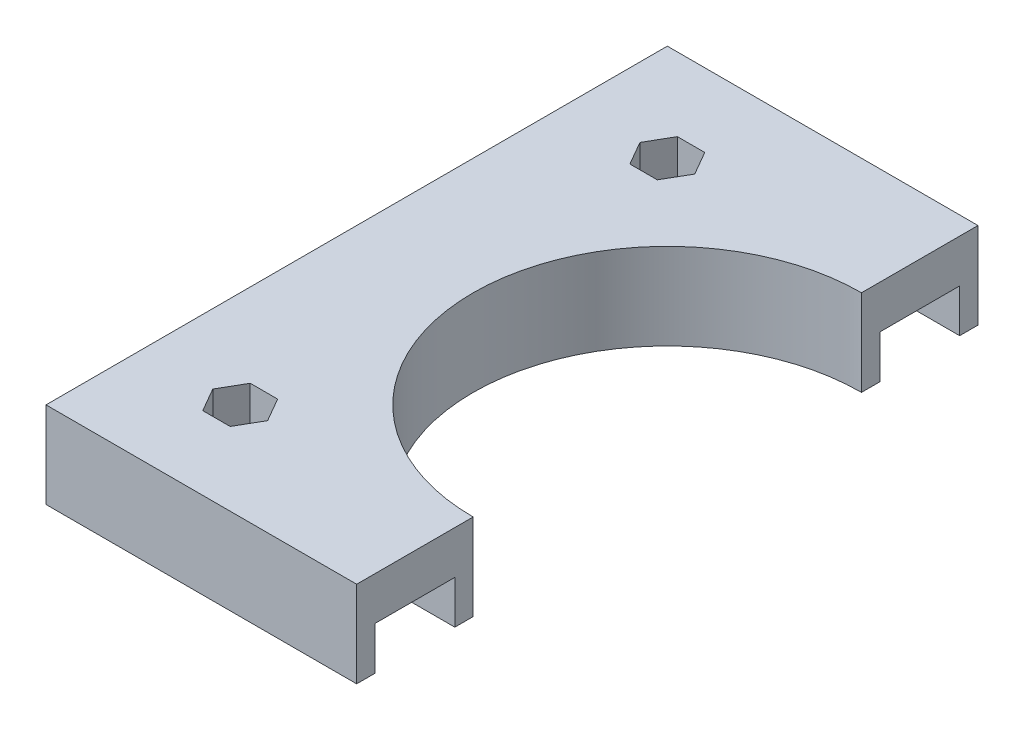
ISO-10303-21;
HEADER;
FILE_DESCRIPTION(('STEP AP214'),'2;1');
FILE_NAME('part.step','',(''),(''),'','','');
FILE_SCHEMA(('AUTOMOTIVE_DESIGN { 1 0 10303 214 1 1 1 1 }'));
ENDSEC;
DATA;
#1=APPLICATION_CONTEXT('core data for automotive mechanical design processes');
#2=APPLICATION_PROTOCOL_DEFINITION('international standard','automotive_design',2000,#1);
#3=PRODUCT_CONTEXT('',#1,'mechanical');
#4=PRODUCT('Part','Part','',(#3));
#5=PRODUCT_RELATED_PRODUCT_CATEGORY('part','',(#4));
#6=PRODUCT_DEFINITION_FORMATION('','',#4);
#7=PRODUCT_DEFINITION_CONTEXT('part definition',#1,'design');
#8=PRODUCT_DEFINITION('design','',#6,#7);
#9=PRODUCT_DEFINITION_SHAPE('','',#8);
#10=(LENGTH_UNIT() NAMED_UNIT(*) SI_UNIT(.MILLI.,.METRE.));
#11=(NAMED_UNIT(*) PLANE_ANGLE_UNIT() SI_UNIT($,.RADIAN.));
#12=(NAMED_UNIT(*) SI_UNIT($,.STERADIAN.) SOLID_ANGLE_UNIT());
#13=UNCERTAINTY_MEASURE_WITH_UNIT(LENGTH_MEASURE(1.E-05),#10,'distance_accuracy_value','');
#14=(GEOMETRIC_REPRESENTATION_CONTEXT(3) GLOBAL_UNCERTAINTY_ASSIGNED_CONTEXT((#13)) GLOBAL_UNIT_ASSIGNED_CONTEXT((#10,
#11,#12)) REPRESENTATION_CONTEXT('',''));
#15=CARTESIAN_POINT('',(0.,0.,0.));
#16=DIRECTION('',(0.,0.,1.));
#17=DIRECTION('',(1.,0.,0.));
#18=AXIS2_PLACEMENT_3D('',#15,#16,#17);
#19=CARTESIAN_POINT('',(0.,-5.,0.));
#20=DIRECTION('',(-1.,0.,0.));
#21=DIRECTION('',(0.,0.,1.));
#22=AXIS2_PLACEMENT_3D('',#19,#20,#21);
#23=PLANE('',#22);
#24=DIRECTION('',(0.,-1.,0.));
#25=VECTOR('',#24,1.);
#26=CARTESIAN_POINT('',(0.,0.,24.625));
#27=LINE('',#26,#25);
#28=CARTESIAN_POINT('',(0.,0.,24.625));
#29=VERTEX_POINT('',#28);
#30=CARTESIAN_POINT('',(0.,-5.,24.625));
#31=VERTEX_POINT('',#30);
#32=EDGE_CURVE('E275',#29,#31,#27,.T.);
#33=ORIENTED_EDGE('',*,*,#32,.T.);
#34=DIRECTION('',(0.,0.,1.));
#35=VECTOR('',#34,1.);
#36=CARTESIAN_POINT('',(0.,-5.,0.));
#37=LINE('',#36,#35);
#38=CARTESIAN_POINT('',(0.,-5.,22.5));
#39=VERTEX_POINT('',#38);
#40=EDGE_CURVE('E462',#39,#31,#37,.T.);
#41=ORIENTED_EDGE('',*,*,#40,.F.);
#42=DIRECTION('',(0.,1.,0.));
#43=VECTOR('',#42,1.);
#44=CARTESIAN_POINT('',(0.,-5.,22.5));
#45=LINE('',#44,#43);
#46=CARTESIAN_POINT('',(0.,5.,22.5));
#47=VERTEX_POINT('',#46);
#48=EDGE_CURVE('E11',#39,#47,#45,.T.);
#49=ORIENTED_EDGE('',*,*,#48,.T.);
#50=DIRECTION('',(0.,0.,1.));
#51=VECTOR('',#50,1.);
#52=CARTESIAN_POINT('',(0.,5.,0.));
#53=LINE('',#52,#51);
#54=CARTESIAN_POINT('',(0.,5.,36.));
#55=VERTEX_POINT('',#54);
#56=EDGE_CURVE('E432',#47,#55,#53,.T.);
#57=ORIENTED_EDGE('',*,*,#56,.T.);
#58=DIRECTION('',(0.,1.,0.));
#59=VECTOR('',#58,1.);
#60=CARTESIAN_POINT('',(0.,-5.,36.));
#61=LINE('',#60,#59);
#62=CARTESIAN_POINT('',(0.,-5.,36.));
#63=VERTEX_POINT('',#62);
#64=EDGE_CURVE('E57',#63,#55,#61,.T.);
#65=ORIENTED_EDGE('',*,*,#64,.F.);
#66=CARTESIAN_POINT('',(0.,-5.,33.875));
#67=VERTEX_POINT('',#66);
#68=EDGE_CURVE('E244',#67,#63,#37,.T.);
#69=ORIENTED_EDGE('',*,*,#68,.F.);
#70=DIRECTION('',(0.,-1.,0.));
#71=VECTOR('',#70,1.);
#72=CARTESIAN_POINT('',(0.,0.,33.875));
#73=LINE('',#72,#71);
#74=CARTESIAN_POINT('',(0.,0.,33.875));
#75=VERTEX_POINT('',#74);
#76=EDGE_CURVE('E65',#75,#67,#73,.T.);
#77=ORIENTED_EDGE('',*,*,#76,.F.);
#78=DIRECTION('',(0.,0.,-1.));
#79=VECTOR('',#78,1.);
#80=CARTESIAN_POINT('',(0.,0.,24.625));
#81=LINE('',#80,#79);
#82=EDGE_CURVE('E231',#75,#29,#81,.T.);
#83=ORIENTED_EDGE('',*,*,#82,.T.);
#84=EDGE_LOOP('',(#33,#41,#49,#57,#65,#69,#77,#83));
#85=FACE_BOUND('',#84,.T.);
#86=ADVANCED_FACE('F47',(#85),#23,.F.);
#87=CARTESIAN_POINT('',(0.,-5.,0.));
#88=DIRECTION('',(0.,1.,0.));
#89=DIRECTION('',(0.,0.,1.));
#90=AXIS2_PLACEMENT_3D('',#87,#88,#89);
#91=PLANE('',#90);
#92=CARTESIAN_POINT('',(-24.7487373415292,-5.,-24.7487373415292));
#93=DIRECTION('',(0.,1.,0.));
#94=DIRECTION('',(0.,0.,1.));
#95=AXIS2_PLACEMENT_3D('',#92,#93,#94);
#96=CIRCLE('',#95,1.5);
#97=CARTESIAN_POINT('',(-24.7487373415292,-5.,-23.2487373415292));
#98=VERTEX_POINT('',#97);
#99=EDGE_CURVE('E448',#98,#98,#96,.T.);
#100=ORIENTED_EDGE('',*,*,#99,.T.);
#101=EDGE_LOOP('',(#100));
#102=FACE_BOUND('',#101,.T.);
#103=CARTESIAN_POINT('',(-24.7487373415292,-5.,24.7487373415292));
#104=DIRECTION('',(0.,1.,0.));
#105=DIRECTION('',(0.,0.,1.));
#106=AXIS2_PLACEMENT_3D('',#103,#104,#105);
#107=CIRCLE('',#106,1.5);
#108=CARTESIAN_POINT('',(-24.7487373415292,-5.,26.2487373415292));
#109=VERTEX_POINT('',#108);
#110=EDGE_CURVE('E444',#109,#109,#107,.T.);
#111=ORIENTED_EDGE('',*,*,#110,.T.);
#112=EDGE_LOOP('',(#111));
#113=FACE_BOUND('',#112,.T.);
#114=DIRECTION('',(-1.,0.,0.));
#115=VECTOR('',#114,1.);
#116=CARTESIAN_POINT('',(0.,-5.,24.625));
#117=LINE('',#116,#115);
#118=CARTESIAN_POINT('',(-9.45427883749799,-5.,24.625));
#119=VERTEX_POINT('',#118);
#120=EDGE_CURVE('E240',#31,#119,#117,.T.);
#121=ORIENTED_EDGE('',*,*,#120,.T.);
#122=DIRECTION('',(0.,0.,1.));
#123=VECTOR('',#122,1.);
#124=CARTESIAN_POINT('',(-9.45427883749799,-5.,24.625));
#125=LINE('',#124,#123);
#126=CARTESIAN_POINT('',(-9.45427883749798,-5.,33.875));
#127=VERTEX_POINT('',#126);
#128=EDGE_CURVE('E576',#119,#127,#125,.T.);
#129=ORIENTED_EDGE('',*,*,#128,.T.);
#130=DIRECTION('',(1.,0.,0.));
#131=VECTOR('',#130,1.);
#132=CARTESIAN_POINT('',(0.,-5.,33.875));
#133=LINE('',#132,#131);
#134=EDGE_CURVE('E579',#127,#67,#133,.T.);
#135=ORIENTED_EDGE('',*,*,#134,.T.);
#136=ORIENTED_EDGE('',*,*,#68,.T.);
#137=DIRECTION('',(1.,0.,0.));
#138=VECTOR('',#137,1.);
#139=CARTESIAN_POINT('',(0.,-5.,36.));
#140=LINE('',#139,#138);
#141=CARTESIAN_POINT('',(-36.,-5.,36.));
#142=VERTEX_POINT('',#141);
#143=EDGE_CURVE('E468',#142,#63,#140,.T.);
#144=ORIENTED_EDGE('',*,*,#143,.F.);
#145=DIRECTION('',(0.,0.,-1.));
#146=VECTOR('',#145,1.);
#147=CARTESIAN_POINT('',(-36.,-5.,0.));
#148=LINE('',#147,#146);
#149=CARTESIAN_POINT('',(-36.,-5.,-36.));
#150=VERTEX_POINT('',#149);
#151=EDGE_CURVE('E465',#142,#150,#148,.T.);
#152=ORIENTED_EDGE('',*,*,#151,.T.);
#153=DIRECTION('',(1.,0.,0.));
#154=VECTOR('',#153,1.);
#155=CARTESIAN_POINT('',(0.,-5.,-36.));
#156=LINE('',#155,#154);
#157=CARTESIAN_POINT('',(0.,-5.,-36.));
#158=VERTEX_POINT('',#157);
#159=EDGE_CURVE('E461',#150,#158,#156,.T.);
#160=ORIENTED_EDGE('',*,*,#159,.T.);
#161=CARTESIAN_POINT('',(0.,-5.,-33.875));
#162=VERTEX_POINT('',#161);
#163=EDGE_CURVE('E457',#158,#162,#37,.T.);
#164=ORIENTED_EDGE('',*,*,#163,.T.);
#165=DIRECTION('',(1.,0.,0.));
#166=VECTOR('',#165,1.);
#167=CARTESIAN_POINT('',(0.,-5.,-33.875));
#168=LINE('',#167,#166);
#169=CARTESIAN_POINT('',(-9.45427883749798,-5.,-33.875));
#170=VERTEX_POINT('',#169);
#171=EDGE_CURVE('E259',#170,#162,#168,.T.);
#172=ORIENTED_EDGE('',*,*,#171,.F.);
#173=DIRECTION('',(0.,0.,-1.));
#174=VECTOR('',#173,1.);
#175=CARTESIAN_POINT('',(-9.45427883749799,-5.,-24.625));
#176=LINE('',#175,#174);
#177=CARTESIAN_POINT('',(-9.45427883749799,-5.,-24.625));
#178=VERTEX_POINT('',#177);
#179=EDGE_CURVE('E274',#178,#170,#176,.T.);
#180=ORIENTED_EDGE('',*,*,#179,.F.);
#181=DIRECTION('',(-1.,0.,0.));
#182=VECTOR('',#181,1.);
#183=CARTESIAN_POINT('',(0.,-5.,-24.625));
#184=LINE('',#183,#182);
#185=CARTESIAN_POINT('',(0.,-5.,-24.625));
#186=VERTEX_POINT('',#185);
#187=EDGE_CURVE('E271',#186,#178,#184,.T.);
#188=ORIENTED_EDGE('',*,*,#187,.F.);
#189=CARTESIAN_POINT('',(0.,-5.,-22.5));
#190=VERTEX_POINT('',#189);
#191=EDGE_CURVE('E456',#186,#190,#37,.T.);
#192=ORIENTED_EDGE('',*,*,#191,.T.);
#193=CARTESIAN_POINT('',(0.,-5.,0.));
#194=DIRECTION('',(0.,1.,0.));
#195=DIRECTION('',(0.,0.,1.));
#196=AXIS2_PLACEMENT_3D('',#193,#194,#195);
#197=CIRCLE('',#196,22.5);
#198=EDGE_CURVE('E452',#190,#39,#197,.T.);
#199=ORIENTED_EDGE('',*,*,#198,.T.);
#200=ORIENTED_EDGE('',*,*,#40,.T.);
#201=EDGE_LOOP('',(#121,#129,#135,#136,#144,#152,#160,#164,#172,#180,#188,#192,#199,#200));
#202=FACE_BOUND('',#201,.T.);
#203=ADVANCED_FACE('F509',(#102,#113,#202),#91,.F.);
#204=CARTESIAN_POINT('',(-24.7487373415292,-5.,24.7487373415292));
#205=DIRECTION('',(0.,1.,0.));
#206=DIRECTION('',(0.,0.,1.));
#207=AXIS2_PLACEMENT_3D('',#204,#205,#206);
#208=CYLINDRICAL_SURFACE('',#207,1.5);
#209=ORIENTED_EDGE('',*,*,#110,.F.);
#210=EDGE_LOOP('',(#209));
#211=FACE_BOUND('',#210,.T.);
#212=CARTESIAN_POINT('',(-24.7487373415292,0.,24.7487373415292));
#213=DIRECTION('',(0.,1.,0.));
#214=DIRECTION('',(0.,0.,1.));
#215=AXIS2_PLACEMENT_3D('',#212,#213,#214);
#216=CIRCLE('',#215,1.5);
#217=CARTESIAN_POINT('',(-24.7487373415292,0.,26.2487373415292));
#218=VERTEX_POINT('',#217);
#219=EDGE_CURVE('E51',#218,#218,#216,.F.);
#220=ORIENTED_EDGE('',*,*,#219,.F.);
#221=EDGE_LOOP('',(#220));
#222=FACE_BOUND('',#221,.T.);
#223=ADVANCED_FACE('F49',(#211,#222),#208,.F.);
#224=CARTESIAN_POINT('',(0.,5.,0.));
#225=DIRECTION('',(0.,1.,0.));
#226=DIRECTION('',(0.,0.,1.));
#227=AXIS2_PLACEMENT_3D('',#224,#225,#226);
#228=PLANE('',#227);
#229=CARTESIAN_POINT('',(0.,5.,0.));
#230=DIRECTION('',(0.,1.,0.));
#231=DIRECTION('',(0.,0.,1.));
#232=AXIS2_PLACEMENT_3D('',#229,#230,#231);
#233=CIRCLE('',#232,22.5);
#234=CARTESIAN_POINT('',(0.,5.,-22.5));
#235=VERTEX_POINT('',#234);
#236=EDGE_CURVE('E423',#235,#47,#233,.T.);
#237=ORIENTED_EDGE('',*,*,#236,.F.);
#238=CARTESIAN_POINT('',(0.,5.,-36.));
#239=VERTEX_POINT('',#238);
#240=EDGE_CURVE('E427',#239,#235,#53,.T.);
#241=ORIENTED_EDGE('',*,*,#240,.F.);
#242=DIRECTION('',(1.,0.,0.));
#243=VECTOR('',#242,1.);
#244=CARTESIAN_POINT('',(0.,5.,-36.));
#245=LINE('',#244,#243);
#246=CARTESIAN_POINT('',(-36.,5.,-36.));
#247=VERTEX_POINT('',#246);
#248=EDGE_CURVE('E431',#247,#239,#245,.T.);
#249=ORIENTED_EDGE('',*,*,#248,.F.);
#250=DIRECTION('',(0.,0.,-1.));
#251=VECTOR('',#250,1.);
#252=CARTESIAN_POINT('',(-36.,5.,0.));
#253=LINE('',#252,#251);
#254=CARTESIAN_POINT('',(-36.,5.,36.));
#255=VERTEX_POINT('',#254);
#256=EDGE_CURVE('E436',#255,#247,#253,.T.);
#257=ORIENTED_EDGE('',*,*,#256,.F.);
#258=DIRECTION('',(1.,0.,0.));
#259=VECTOR('',#258,1.);
#260=CARTESIAN_POINT('',(0.,5.,36.));
#261=LINE('',#260,#259);
#262=EDGE_CURVE('E440',#255,#55,#261,.T.);
#263=ORIENTED_EDGE('',*,*,#262,.T.);
#264=ORIENTED_EDGE('',*,*,#56,.F.);
#265=EDGE_LOOP('',(#237,#241,#249,#257,#263,#264));
#266=FACE_BOUND('',#265,.T.);
#267=DIRECTION('',(-0.500000000000006,0.,-0.866025403784435));
#268=VECTOR('',#267,1.);
#269=CARTESIAN_POINT('',(-21.5733108609862,5.,-24.7487373415292));
#270=LINE('',#269,#268);
#271=CARTESIAN_POINT('',(-21.5733108609862,5.,-24.7487373415292));
#272=VERTEX_POINT('',#271);
#273=CARTESIAN_POINT('',(-23.1610241012577,5.,-27.4987373415292));
#274=VERTEX_POINT('',#273);
#275=EDGE_CURVE('E382',#272,#274,#270,.T.);
#276=ORIENTED_EDGE('',*,*,#275,.F.);
#277=DIRECTION('',(0.499999999999995,0.,-0.866025403784442));
#278=VECTOR('',#277,1.);
#279=CARTESIAN_POINT('',(-23.1610241012577,5.,-21.9987373415292));
#280=LINE('',#279,#278);
#281=CARTESIAN_POINT('',(-23.1610241012577,5.,-21.9987373415292));
#282=VERTEX_POINT('',#281);
#283=EDGE_CURVE('E361',#282,#272,#280,.T.);
#284=ORIENTED_EDGE('',*,*,#283,.F.);
#285=DIRECTION('',(1.,0.,0.));
#286=VECTOR('',#285,1.);
#287=CARTESIAN_POINT('',(-26.3364505818006,5.,-21.9987373415292));
#288=LINE('',#287,#286);
#289=CARTESIAN_POINT('',(-26.3364505818006,5.,-21.9987373415292));
#290=VERTEX_POINT('',#289);
#291=EDGE_CURVE('E397',#290,#282,#288,.T.);
#292=ORIENTED_EDGE('',*,*,#291,.F.);
#293=DIRECTION('',(0.500000000000006,0.,0.866025403784435));
#294=VECTOR('',#293,1.);
#295=CARTESIAN_POINT('',(-27.9241638220721,5.,-24.7487373415291));
#296=LINE('',#295,#294);
#297=CARTESIAN_POINT('',(-27.9241638220721,5.,-24.7487373415291));
#298=VERTEX_POINT('',#297);
#299=EDGE_CURVE('E393',#298,#290,#296,.T.);
#300=ORIENTED_EDGE('',*,*,#299,.F.);
#301=DIRECTION('',(-0.499999999999993,0.,0.866025403784443));
#302=VECTOR('',#301,1.);
#303=CARTESIAN_POINT('',(-26.3364505818006,5.,-27.4987373415292));
#304=LINE('',#303,#302);
#305=CARTESIAN_POINT('',(-26.3364505818006,5.,-27.4987373415292));
#306=VERTEX_POINT('',#305);
#307=EDGE_CURVE('E389',#306,#298,#304,.T.);
#308=ORIENTED_EDGE('',*,*,#307,.F.);
#309=DIRECTION('',(-1.,0.,0.));
#310=VECTOR('',#309,1.);
#311=CARTESIAN_POINT('',(-23.1610241012577,5.,-27.4987373415292));
#312=LINE('',#311,#310);
#313=EDGE_CURVE('E385',#274,#306,#312,.T.);
#314=ORIENTED_EDGE('',*,*,#313,.F.);
#315=EDGE_LOOP('',(#276,#284,#292,#300,#308,#314));
#316=FACE_BOUND('',#315,.T.);
#317=DIRECTION('',(0.499999999999995,0.,0.866025403784442));
#318=VECTOR('',#317,1.);
#319=CARTESIAN_POINT('',(-23.1610241012577,5.,21.9987373415292));
#320=LINE('',#319,#318);
#321=CARTESIAN_POINT('',(-23.1610241012577,5.,21.9987373415292));
#322=VERTEX_POINT('',#321);
#323=CARTESIAN_POINT('',(-21.5733108609862,5.,24.7487373415292));
#324=VERTEX_POINT('',#323);
#325=EDGE_CURVE('E318',#322,#324,#320,.T.);
#326=ORIENTED_EDGE('',*,*,#325,.T.);
#327=DIRECTION('',(-0.500000000000006,0.,0.866025403784435));
#328=VECTOR('',#327,1.);
#329=CARTESIAN_POINT('',(-21.5733108609862,5.,24.7487373415292));
#330=LINE('',#329,#328);
#331=CARTESIAN_POINT('',(-23.1610241012577,5.,27.4987373415292));
#332=VERTEX_POINT('',#331);
#333=EDGE_CURVE('E285',#324,#332,#330,.T.);
#334=ORIENTED_EDGE('',*,*,#333,.T.);
#335=DIRECTION('',(-1.,0.,0.));
#336=VECTOR('',#335,1.);
#337=CARTESIAN_POINT('',(-23.1610241012577,5.,27.4987373415292));
#338=LINE('',#337,#336);
#339=CARTESIAN_POINT('',(-26.3364505818006,5.,27.4987373415292));
#340=VERTEX_POINT('',#339);
#341=EDGE_CURVE('E299',#332,#340,#338,.T.);
#342=ORIENTED_EDGE('',*,*,#341,.T.);
#343=DIRECTION('',(-0.499999999999993,0.,-0.866025403784443));
#344=VECTOR('',#343,1.);
#345=CARTESIAN_POINT('',(-26.3364505818006,5.,27.4987373415292));
#346=LINE('',#345,#344);
#347=CARTESIAN_POINT('',(-27.9241638220721,5.,24.7487373415291));
#348=VERTEX_POINT('',#347);
#349=EDGE_CURVE('E330',#340,#348,#346,.T.);
#350=ORIENTED_EDGE('',*,*,#349,.T.);
#351=DIRECTION('',(0.500000000000006,0.,-0.866025403784435));
#352=VECTOR('',#351,1.);
#353=CARTESIAN_POINT('',(-27.9241638220721,5.,24.7487373415291));
#354=LINE('',#353,#352);
#355=CARTESIAN_POINT('',(-26.3364505818006,5.,21.9987373415292));
#356=VERTEX_POINT('',#355);
#357=EDGE_CURVE('E326',#348,#356,#354,.T.);
#358=ORIENTED_EDGE('',*,*,#357,.T.);
#359=DIRECTION('',(1.,0.,0.));
#360=VECTOR('',#359,1.);
#361=CARTESIAN_POINT('',(-26.3364505818006,5.,21.9987373415292));
#362=LINE('',#361,#360);
#363=EDGE_CURVE('E322',#356,#322,#362,.T.);
#364=ORIENTED_EDGE('',*,*,#363,.T.);
#365=EDGE_LOOP('',(#326,#334,#342,#350,#358,#364));
#366=FACE_BOUND('',#365,.T.);
#367=ADVANCED_FACE('F494',(#266,#316,#366),#228,.T.);
#368=CARTESIAN_POINT('',(-24.7487373415292,-5.,-24.7487373415292));
#369=DIRECTION('',(0.,1.,0.));
#370=DIRECTION('',(0.,0.,1.));
#371=AXIS2_PLACEMENT_3D('',#368,#369,#370);
#372=CYLINDRICAL_SURFACE('',#371,1.5);
#373=ORIENTED_EDGE('',*,*,#99,.F.);
#374=EDGE_LOOP('',(#373));
#375=FACE_BOUND('',#374,.T.);
#376=CARTESIAN_POINT('',(-24.7487373415292,0.,-24.7487373415292));
#377=DIRECTION('',(0.,1.,0.));
#378=DIRECTION('',(0.,0.,1.));
#379=AXIS2_PLACEMENT_3D('',#376,#377,#378);
#380=CIRCLE('',#379,1.5);
#381=CARTESIAN_POINT('',(-24.7487373415292,0.,-23.2487373415292));
#382=VERTEX_POINT('',#381);
#383=EDGE_CURVE('E407',#382,#382,#380,.F.);
#384=ORIENTED_EDGE('',*,*,#383,.F.);
#385=EDGE_LOOP('',(#384));
#386=FACE_BOUND('',#385,.T.);
#387=ADVANCED_FACE('F491',(#375,#386),#372,.F.);
#388=CARTESIAN_POINT('',(0.,-5.,0.));
#389=DIRECTION('',(0.,1.,0.));
#390=DIRECTION('',(0.,0.,1.));
#391=AXIS2_PLACEMENT_3D('',#388,#389,#390);
#392=CYLINDRICAL_SURFACE('',#391,22.5);
#393=DIRECTION('',(0.,1.,0.));
#394=VECTOR('',#393,1.);
#395=CARTESIAN_POINT('',(0.,-5.,-22.5));
#396=LINE('',#395,#394);
#397=EDGE_CURVE('E483',#190,#235,#396,.T.);
#398=ORIENTED_EDGE('',*,*,#397,.T.);
#399=ORIENTED_EDGE('',*,*,#236,.T.);
#400=ORIENTED_EDGE('',*,*,#48,.F.);
#401=ORIENTED_EDGE('',*,*,#198,.F.);
#402=EDGE_LOOP('',(#398,#399,#400,#401));
#403=FACE_BOUND('',#402,.T.);
#404=ADVANCED_FACE('F493',(#403),#392,.F.);
#405=CARTESIAN_POINT('',(0.,-5.,36.));
#406=DIRECTION('',(0.,0.,1.));
#407=DIRECTION('',(1.,0.,0.));
#408=AXIS2_PLACEMENT_3D('',#405,#406,#407);
#409=PLANE('',#408);
#410=ORIENTED_EDGE('',*,*,#64,.T.);
#411=ORIENTED_EDGE('',*,*,#262,.F.);
#412=DIRECTION('',(0.,1.,0.));
#413=VECTOR('',#412,1.);
#414=CARTESIAN_POINT('',(-36.,-5.,36.));
#415=LINE('',#414,#413);
#416=EDGE_CURVE('E474',#142,#255,#415,.T.);
#417=ORIENTED_EDGE('',*,*,#416,.F.);
#418=ORIENTED_EDGE('',*,*,#143,.T.);
#419=EDGE_LOOP('',(#410,#411,#417,#418));
#420=FACE_BOUND('',#419,.T.);
#421=ADVANCED_FACE('F501',(#420),#409,.T.);
#422=CARTESIAN_POINT('',(-36.,-5.,0.));
#423=DIRECTION('',(1.,0.,0.));
#424=DIRECTION('',(0.,0.,-1.));
#425=AXIS2_PLACEMENT_3D('',#422,#423,#424);
#426=PLANE('',#425);
#427=ORIENTED_EDGE('',*,*,#416,.T.);
#428=ORIENTED_EDGE('',*,*,#256,.T.);
#429=DIRECTION('',(0.,1.,0.));
#430=VECTOR('',#429,1.);
#431=CARTESIAN_POINT('',(-36.,-5.,-36.));
#432=LINE('',#431,#430);
#433=EDGE_CURVE('E477',#150,#247,#432,.T.);
#434=ORIENTED_EDGE('',*,*,#433,.F.);
#435=ORIENTED_EDGE('',*,*,#151,.F.);
#436=EDGE_LOOP('',(#427,#428,#434,#435));
#437=FACE_BOUND('',#436,.T.);
#438=ADVANCED_FACE('F529',(#437),#426,.F.);
#439=CARTESIAN_POINT('',(0.,-5.,-36.));
#440=DIRECTION('',(0.,0.,1.));
#441=DIRECTION('',(1.,0.,0.));
#442=AXIS2_PLACEMENT_3D('',#439,#440,#441);
#443=PLANE('',#442);
#444=ORIENTED_EDGE('',*,*,#433,.T.);
#445=ORIENTED_EDGE('',*,*,#248,.T.);
#446=DIRECTION('',(0.,1.,0.));
#447=VECTOR('',#446,1.);
#448=CARTESIAN_POINT('',(0.,-5.,-36.));
#449=LINE('',#448,#447);
#450=EDGE_CURVE('E480',#158,#239,#449,.T.);
#451=ORIENTED_EDGE('',*,*,#450,.F.);
#452=ORIENTED_EDGE('',*,*,#159,.F.);
#453=EDGE_LOOP('',(#444,#445,#451,#452));
#454=FACE_BOUND('',#453,.T.);
#455=ADVANCED_FACE('F520',(#454),#443,.F.);
#456=DIRECTION('',(0.,0.,1.));
#457=VECTOR('',#456,1.);
#458=CARTESIAN_POINT('',(0.,0.,-24.625));
#459=LINE('',#458,#457);
#460=CARTESIAN_POINT('',(0.,0.,-33.875));
#461=VERTEX_POINT('',#460);
#462=CARTESIAN_POINT('',(0.,0.,-24.625));
#463=VERTEX_POINT('',#462);
#464=EDGE_CURVE('E254',#461,#463,#459,.T.);
#465=ORIENTED_EDGE('',*,*,#464,.F.);
#466=DIRECTION('',(0.,-1.,0.));
#467=VECTOR('',#466,1.);
#468=CARTESIAN_POINT('',(0.,0.,-33.875));
#469=LINE('',#468,#467);
#470=EDGE_CURVE('E281',#461,#162,#469,.T.);
#471=ORIENTED_EDGE('',*,*,#470,.T.);
#472=ORIENTED_EDGE('',*,*,#163,.F.);
#473=ORIENTED_EDGE('',*,*,#450,.T.);
#474=ORIENTED_EDGE('',*,*,#240,.T.);
#475=ORIENTED_EDGE('',*,*,#397,.F.);
#476=ORIENTED_EDGE('',*,*,#191,.F.);
#477=DIRECTION('',(0.,-1.,0.));
#478=VECTOR('',#477,1.);
#479=CARTESIAN_POINT('',(0.,0.,-24.625));
#480=LINE('',#479,#478);
#481=EDGE_CURVE('E73',#463,#186,#480,.T.);
#482=ORIENTED_EDGE('',*,*,#481,.F.);
#483=EDGE_LOOP('',(#465,#471,#472,#473,#474,#475,#476,#482));
#484=FACE_BOUND('',#483,.T.);
#485=ADVANCED_FACE('F511',(#484),#23,.F.);
#486=CARTESIAN_POINT('',(0.,0.,0.));
#487=DIRECTION('',(0.,1.,0.));
#488=DIRECTION('',(0.,0.,1.));
#489=AXIS2_PLACEMENT_3D('',#486,#487,#488);
#490=PLANE('',#489);
#491=DIRECTION('',(-0.500000000000006,0.,-0.866025403784435));
#492=VECTOR('',#491,1.);
#493=CARTESIAN_POINT('',(-21.5733108609862,0.,-24.7487373415292));
#494=LINE('',#493,#492);
#495=CARTESIAN_POINT('',(-21.5733108609862,0.,-24.7487373415292));
#496=VERTEX_POINT('',#495);
#497=CARTESIAN_POINT('',(-23.1610241012577,0.,-27.4987373415292));
#498=VERTEX_POINT('',#497);
#499=EDGE_CURVE('E356',#496,#498,#494,.T.);
#500=ORIENTED_EDGE('',*,*,#499,.T.);
#501=DIRECTION('',(-1.,0.,0.));
#502=VECTOR('',#501,1.);
#503=CARTESIAN_POINT('',(-23.1610241012577,0.,-27.4987373415292));
#504=LINE('',#503,#502);
#505=CARTESIAN_POINT('',(-26.3364505818006,0.,-27.4987373415292));
#506=VERTEX_POINT('',#505);
#507=EDGE_CURVE('E360',#498,#506,#504,.T.);
#508=ORIENTED_EDGE('',*,*,#507,.T.);
#509=DIRECTION('',(-0.499999999999993,0.,0.866025403784443));
#510=VECTOR('',#509,1.);
#511=CARTESIAN_POINT('',(-26.3364505818006,0.,-27.4987373415292));
#512=LINE('',#511,#510);
#513=CARTESIAN_POINT('',(-27.9241638220721,0.,-24.7487373415291));
#514=VERTEX_POINT('',#513);
#515=EDGE_CURVE('E365',#506,#514,#512,.T.);
#516=ORIENTED_EDGE('',*,*,#515,.T.);
#517=DIRECTION('',(0.500000000000006,0.,0.866025403784435));
#518=VECTOR('',#517,1.);
#519=CARTESIAN_POINT('',(-27.9241638220721,0.,-24.7487373415291));
#520=LINE('',#519,#518);
#521=CARTESIAN_POINT('',(-26.3364505818006,0.,-21.9987373415292));
#522=VERTEX_POINT('',#521);
#523=EDGE_CURVE('E369',#514,#522,#520,.T.);
#524=ORIENTED_EDGE('',*,*,#523,.T.);
#525=DIRECTION('',(1.,0.,0.));
#526=VECTOR('',#525,1.);
#527=CARTESIAN_POINT('',(-26.3364505818006,0.,-21.9987373415292));
#528=LINE('',#527,#526);
#529=CARTESIAN_POINT('',(-23.1610241012577,0.,-21.9987373415292));
#530=VERTEX_POINT('',#529);
#531=EDGE_CURVE('E373',#522,#530,#528,.T.);
#532=ORIENTED_EDGE('',*,*,#531,.T.);
#533=DIRECTION('',(0.499999999999995,0.,-0.866025403784442));
#534=VECTOR('',#533,1.);
#535=CARTESIAN_POINT('',(-23.1610241012577,0.,-21.9987373415292));
#536=LINE('',#535,#534);
#537=EDGE_CURVE('E377',#530,#496,#536,.T.);
#538=ORIENTED_EDGE('',*,*,#537,.T.);
#539=EDGE_LOOP('',(#500,#508,#516,#524,#532,#538));
#540=FACE_BOUND('',#539,.T.);
#541=ORIENTED_EDGE('',*,*,#383,.T.);
#542=EDGE_LOOP('',(#541));
#543=FACE_BOUND('',#542,.T.);
#544=ADVANCED_FACE('F489',(#540,#543),#490,.T.);
#545=CARTESIAN_POINT('',(-21.5733108609862,0.,-24.7487373415292));
#546=DIRECTION('',(0.866025403784435,0.,-0.500000000000006));
#547=DIRECTION('',(-0.500000000000006,0.,-0.866025403784435));
#548=AXIS2_PLACEMENT_3D('',#545,#546,#547);
#549=PLANE('',#548);
#550=ORIENTED_EDGE('',*,*,#275,.T.);
#551=DIRECTION('',(0.,1.,0.));
#552=VECTOR('',#551,1.);
#553=CARTESIAN_POINT('',(-23.1610241012577,0.,-27.4987373415292));
#554=LINE('',#553,#552);
#555=EDGE_CURVE('E381',#498,#274,#554,.T.);
#556=ORIENTED_EDGE('',*,*,#555,.F.);
#557=ORIENTED_EDGE('',*,*,#499,.F.);
#558=DIRECTION('',(0.,1.,0.));
#559=VECTOR('',#558,1.);
#560=CARTESIAN_POINT('',(-21.5733108609862,0.,-24.7487373415292));
#561=LINE('',#560,#559);
#562=EDGE_CURVE('E404',#496,#272,#561,.T.);
#563=ORIENTED_EDGE('',*,*,#562,.T.);
#564=EDGE_LOOP('',(#550,#556,#557,#563));
#565=FACE_BOUND('',#564,.T.);
#566=ADVANCED_FACE('F526',(#565),#549,.F.);
#567=CARTESIAN_POINT('',(-23.1610241012577,0.,-21.9987373415292));
#568=DIRECTION('',(0.866025403784442,0.,0.499999999999995));
#569=DIRECTION('',(0.499999999999995,0.,-0.866025403784442));
#570=AXIS2_PLACEMENT_3D('',#567,#568,#569);
#571=PLANE('',#570);
#572=ORIENTED_EDGE('',*,*,#283,.T.);
#573=ORIENTED_EDGE('',*,*,#562,.F.);
#574=ORIENTED_EDGE('',*,*,#537,.F.);
#575=DIRECTION('',(0.,1.,0.));
#576=VECTOR('',#575,1.);
#577=CARTESIAN_POINT('',(-23.1610241012577,0.,-21.9987373415292));
#578=LINE('',#577,#576);
#579=EDGE_CURVE('E408',#530,#282,#578,.T.);
#580=ORIENTED_EDGE('',*,*,#579,.T.);
#581=EDGE_LOOP('',(#572,#573,#574,#580));
#582=FACE_BOUND('',#581,.T.);
#583=ADVANCED_FACE('F635',(#582),#571,.F.);
#584=CARTESIAN_POINT('',(-26.3364505818006,0.,-21.9987373415292));
#585=DIRECTION('',(0.,0.,1.));
#586=DIRECTION('',(1.,0.,0.));
#587=AXIS2_PLACEMENT_3D('',#584,#585,#586);
#588=PLANE('',#587);
#589=ORIENTED_EDGE('',*,*,#291,.T.);
#590=ORIENTED_EDGE('',*,*,#579,.F.);
#591=ORIENTED_EDGE('',*,*,#531,.F.);
#592=DIRECTION('',(0.,1.,0.));
#593=VECTOR('',#592,1.);
#594=CARTESIAN_POINT('',(-26.3364505818006,0.,-21.9987373415292));
#595=LINE('',#594,#593);
#596=EDGE_CURVE('E411',#522,#290,#595,.T.);
#597=ORIENTED_EDGE('',*,*,#596,.T.);
#598=EDGE_LOOP('',(#589,#590,#591,#597));
#599=FACE_BOUND('',#598,.T.);
#600=ADVANCED_FACE('F638',(#599),#588,.F.);
#601=CARTESIAN_POINT('',(-27.9241638220721,0.,-24.7487373415291));
#602=DIRECTION('',(-0.866025403784435,0.,0.500000000000006));
#603=DIRECTION('',(0.500000000000006,0.,0.866025403784435));
#604=AXIS2_PLACEMENT_3D('',#601,#602,#603);
#605=PLANE('',#604);
#606=ORIENTED_EDGE('',*,*,#299,.T.);
#607=ORIENTED_EDGE('',*,*,#596,.F.);
#608=ORIENTED_EDGE('',*,*,#523,.F.);
#609=DIRECTION('',(0.,1.,0.));
#610=VECTOR('',#609,1.);
#611=CARTESIAN_POINT('',(-27.9241638220721,0.,-24.7487373415291));
#612=LINE('',#611,#610);
#613=EDGE_CURVE('E414',#514,#298,#612,.T.);
#614=ORIENTED_EDGE('',*,*,#613,.T.);
#615=EDGE_LOOP('',(#606,#607,#608,#614));
#616=FACE_BOUND('',#615,.T.);
#617=ADVANCED_FACE('F642',(#616),#605,.F.);
#618=CARTESIAN_POINT('',(-26.3364505818006,0.,-27.4987373415292));
#619=DIRECTION('',(-0.866025403784442,0.,-0.499999999999993));
#620=DIRECTION('',(-0.499999999999993,0.,0.866025403784442));
#621=AXIS2_PLACEMENT_3D('',#618,#619,#620);
#622=PLANE('',#621);
#623=ORIENTED_EDGE('',*,*,#307,.T.);
#624=ORIENTED_EDGE('',*,*,#613,.F.);
#625=ORIENTED_EDGE('',*,*,#515,.F.);
#626=DIRECTION('',(0.,1.,0.));
#627=VECTOR('',#626,1.);
#628=CARTESIAN_POINT('',(-26.3364505818006,0.,-27.4987373415292));
#629=LINE('',#628,#627);
#630=EDGE_CURVE('E417',#506,#306,#629,.T.);
#631=ORIENTED_EDGE('',*,*,#630,.T.);
#632=EDGE_LOOP('',(#623,#624,#625,#631));
#633=FACE_BOUND('',#632,.T.);
#634=ADVANCED_FACE('F646',(#633),#622,.F.);
#635=CARTESIAN_POINT('',(-23.1610241012577,0.,-27.4987373415292));
#636=DIRECTION('',(0.,0.,-1.));
#637=DIRECTION('',(-1.,0.,0.));
#638=AXIS2_PLACEMENT_3D('',#635,#636,#637);
#639=PLANE('',#638);
#640=ORIENTED_EDGE('',*,*,#313,.T.);
#641=ORIENTED_EDGE('',*,*,#630,.F.);
#642=ORIENTED_EDGE('',*,*,#507,.F.);
#643=ORIENTED_EDGE('',*,*,#555,.T.);
#644=EDGE_LOOP('',(#640,#641,#642,#643));
#645=FACE_BOUND('',#644,.T.);
#646=ADVANCED_FACE('F612',(#645),#639,.F.);
#647=CARTESIAN_POINT('',(0.,0.,0.));
#648=DIRECTION('',(0.,1.,0.));
#649=DIRECTION('',(0.,0.,-1.));
#650=AXIS2_PLACEMENT_3D('',#647,#648,#649);
#651=PLANE('',#650);
#652=DIRECTION('',(-0.500000000000006,0.,0.866025403784435));
#653=VECTOR('',#652,1.);
#654=CARTESIAN_POINT('',(-21.5733108609862,0.,24.7487373415292));
#655=LINE('',#654,#653);
#656=CARTESIAN_POINT('',(-21.5733108609862,0.,24.7487373415292));
#657=VERTEX_POINT('',#656);
#658=CARTESIAN_POINT('',(-23.1610241012577,0.,27.4987373415292));
#659=VERTEX_POINT('',#658);
#660=EDGE_CURVE('E294',#657,#659,#655,.T.);
#661=ORIENTED_EDGE('',*,*,#660,.F.);
#662=DIRECTION('',(0.499999999999995,0.,0.866025403784442));
#663=VECTOR('',#662,1.);
#664=CARTESIAN_POINT('',(-23.1610241012577,0.,21.9987373415292));
#665=LINE('',#664,#663);
#666=CARTESIAN_POINT('',(-23.1610241012577,0.,21.9987373415292));
#667=VERTEX_POINT('',#666);
#668=EDGE_CURVE('E298',#667,#657,#665,.T.);
#669=ORIENTED_EDGE('',*,*,#668,.F.);
#670=DIRECTION('',(1.,0.,0.));
#671=VECTOR('',#670,1.);
#672=CARTESIAN_POINT('',(-26.3364505818006,0.,21.9987373415292));
#673=LINE('',#672,#671);
#674=CARTESIAN_POINT('',(-26.3364505818006,0.,21.9987373415292));
#675=VERTEX_POINT('',#674);
#676=EDGE_CURVE('E302',#675,#667,#673,.T.);
#677=ORIENTED_EDGE('',*,*,#676,.F.);
#678=DIRECTION('',(0.500000000000006,0.,-0.866025403784435));
#679=VECTOR('',#678,1.);
#680=CARTESIAN_POINT('',(-27.9241638220721,0.,24.7487373415291));
#681=LINE('',#680,#679);
#682=CARTESIAN_POINT('',(-27.9241638220721,0.,24.7487373415291));
#683=VERTEX_POINT('',#682);
#684=EDGE_CURVE('E305',#683,#675,#681,.T.);
#685=ORIENTED_EDGE('',*,*,#684,.F.);
#686=DIRECTION('',(-0.499999999999993,0.,-0.866025403784443));
#687=VECTOR('',#686,1.);
#688=CARTESIAN_POINT('',(-26.3364505818006,0.,27.4987373415292));
#689=LINE('',#688,#687);
#690=CARTESIAN_POINT('',(-26.3364505818006,0.,27.4987373415292));
#691=VERTEX_POINT('',#690);
#692=EDGE_CURVE('E308',#691,#683,#689,.T.);
#693=ORIENTED_EDGE('',*,*,#692,.F.);
#694=DIRECTION('',(-1.,0.,0.));
#695=VECTOR('',#694,1.);
#696=CARTESIAN_POINT('',(-23.1610241012577,0.,27.4987373415292));
#697=LINE('',#696,#695);
#698=EDGE_CURVE('E311',#659,#691,#697,.T.);
#699=ORIENTED_EDGE('',*,*,#698,.F.);
#700=EDGE_LOOP('',(#661,#669,#677,#685,#693,#699));
#701=FACE_BOUND('',#700,.T.);
#702=ORIENTED_EDGE('',*,*,#219,.T.);
#703=EDGE_LOOP('',(#702));
#704=FACE_BOUND('',#703,.T.);
#705=ADVANCED_FACE('F608',(#701,#704),#651,.T.);
#706=CARTESIAN_POINT('',(-21.5733108609862,0.,24.7487373415292));
#707=DIRECTION('',(-0.866025403784435,0.,-0.500000000000006));
#708=DIRECTION('',(-0.500000000000006,0.,0.866025403784435));
#709=AXIS2_PLACEMENT_3D('',#706,#707,#708);
#710=PLANE('',#709);
#711=ORIENTED_EDGE('',*,*,#333,.F.);
#712=DIRECTION('',(0.,1.,0.));
#713=VECTOR('',#712,1.);
#714=CARTESIAN_POINT('',(-21.5733108609862,0.,24.7487373415292));
#715=LINE('',#714,#713);
#716=EDGE_CURVE('E314',#657,#324,#715,.T.);
#717=ORIENTED_EDGE('',*,*,#716,.F.);
#718=ORIENTED_EDGE('',*,*,#660,.T.);
#719=DIRECTION('',(0.,1.,0.));
#720=VECTOR('',#719,1.);
#721=CARTESIAN_POINT('',(-23.1610241012577,0.,27.4987373415292));
#722=LINE('',#721,#720);
#723=EDGE_CURVE('E337',#659,#332,#722,.T.);
#724=ORIENTED_EDGE('',*,*,#723,.T.);
#725=EDGE_LOOP('',(#711,#717,#718,#724));
#726=FACE_BOUND('',#725,.T.);
#727=ADVANCED_FACE('F611',(#726),#710,.T.);
#728=CARTESIAN_POINT('',(-23.1610241012577,0.,27.4987373415292));
#729=DIRECTION('',(0.,0.,-1.));
#730=DIRECTION('',(-1.,0.,0.));
#731=AXIS2_PLACEMENT_3D('',#728,#729,#730);
#732=PLANE('',#731);
#733=ORIENTED_EDGE('',*,*,#341,.F.);
#734=ORIENTED_EDGE('',*,*,#723,.F.);
#735=ORIENTED_EDGE('',*,*,#698,.T.);
#736=DIRECTION('',(0.,1.,0.));
#737=VECTOR('',#736,1.);
#738=CARTESIAN_POINT('',(-26.3364505818006,0.,27.4987373415292));
#739=LINE('',#738,#737);
#740=EDGE_CURVE('E341',#691,#340,#739,.T.);
#741=ORIENTED_EDGE('',*,*,#740,.T.);
#742=EDGE_LOOP('',(#733,#734,#735,#741));
#743=FACE_BOUND('',#742,.T.);
#744=ADVANCED_FACE('F614',(#743),#732,.T.);
#745=CARTESIAN_POINT('',(-26.3364505818006,0.,27.4987373415292));
#746=DIRECTION('',(0.866025403784442,0.,-0.499999999999993));
#747=DIRECTION('',(-0.499999999999993,0.,-0.866025403784442));
#748=AXIS2_PLACEMENT_3D('',#745,#746,#747);
#749=PLANE('',#748);
#750=ORIENTED_EDGE('',*,*,#349,.F.);
#751=ORIENTED_EDGE('',*,*,#740,.F.);
#752=ORIENTED_EDGE('',*,*,#692,.T.);
#753=DIRECTION('',(0.,1.,0.));
#754=VECTOR('',#753,1.);
#755=CARTESIAN_POINT('',(-27.9241638220721,0.,24.7487373415291));
#756=LINE('',#755,#754);
#757=EDGE_CURVE('E344',#683,#348,#756,.T.);
#758=ORIENTED_EDGE('',*,*,#757,.T.);
#759=EDGE_LOOP('',(#750,#751,#752,#758));
#760=FACE_BOUND('',#759,.T.);
#761=ADVANCED_FACE('F617',(#760),#749,.T.);
#762=CARTESIAN_POINT('',(-27.9241638220721,0.,24.7487373415291));
#763=DIRECTION('',(0.866025403784435,0.,0.500000000000006));
#764=DIRECTION('',(0.500000000000006,0.,-0.866025403784435));
#765=AXIS2_PLACEMENT_3D('',#762,#763,#764);
#766=PLANE('',#765);
#767=ORIENTED_EDGE('',*,*,#357,.F.);
#768=ORIENTED_EDGE('',*,*,#757,.F.);
#769=ORIENTED_EDGE('',*,*,#684,.T.);
#770=DIRECTION('',(0.,1.,0.));
#771=VECTOR('',#770,1.);
#772=CARTESIAN_POINT('',(-26.3364505818006,0.,21.9987373415292));
#773=LINE('',#772,#771);
#774=EDGE_CURVE('E347',#675,#356,#773,.T.);
#775=ORIENTED_EDGE('',*,*,#774,.T.);
#776=EDGE_LOOP('',(#767,#768,#769,#775));
#777=FACE_BOUND('',#776,.T.);
#778=ADVANCED_FACE('F621',(#777),#766,.T.);
#779=CARTESIAN_POINT('',(-26.3364505818006,0.,21.9987373415292));
#780=DIRECTION('',(0.,0.,1.));
#781=DIRECTION('',(1.,0.,0.));
#782=AXIS2_PLACEMENT_3D('',#779,#780,#781);
#783=PLANE('',#782);
#784=ORIENTED_EDGE('',*,*,#363,.F.);
#785=ORIENTED_EDGE('',*,*,#774,.F.);
#786=ORIENTED_EDGE('',*,*,#676,.T.);
#787=DIRECTION('',(0.,1.,0.));
#788=VECTOR('',#787,1.);
#789=CARTESIAN_POINT('',(-23.1610241012577,0.,21.9987373415292));
#790=LINE('',#789,#788);
#791=EDGE_CURVE('E350',#667,#322,#790,.T.);
#792=ORIENTED_EDGE('',*,*,#791,.T.);
#793=EDGE_LOOP('',(#784,#785,#786,#792));
#794=FACE_BOUND('',#793,.T.);
#795=ADVANCED_FACE('F625',(#794),#783,.T.);
#796=CARTESIAN_POINT('',(-23.1610241012577,0.,21.9987373415292));
#797=DIRECTION('',(-0.866025403784442,0.,0.499999999999995));
#798=DIRECTION('',(0.499999999999995,0.,0.866025403784442));
#799=AXIS2_PLACEMENT_3D('',#796,#797,#798);
#800=PLANE('',#799);
#801=ORIENTED_EDGE('',*,*,#325,.F.);
#802=ORIENTED_EDGE('',*,*,#791,.F.);
#803=ORIENTED_EDGE('',*,*,#668,.T.);
#804=ORIENTED_EDGE('',*,*,#716,.T.);
#805=EDGE_LOOP('',(#801,#802,#803,#804));
#806=FACE_BOUND('',#805,.T.);
#807=ADVANCED_FACE('F602',(#806),#800,.T.);
#808=CARTESIAN_POINT('',(0.,0.,-33.875));
#809=DIRECTION('',(0.,0.,-1.));
#810=DIRECTION('',(-1.,0.,0.));
#811=AXIS2_PLACEMENT_3D('',#808,#809,#810);
#812=PLANE('',#811);
#813=ORIENTED_EDGE('',*,*,#171,.T.);
#814=ORIENTED_EDGE('',*,*,#470,.F.);
#815=DIRECTION('',(1.,0.,0.));
#816=VECTOR('',#815,1.);
#817=CARTESIAN_POINT('',(0.,0.,-33.875));
#818=LINE('',#817,#816);
#819=CARTESIAN_POINT('',(-9.45427883749798,0.,-33.875));
#820=VERTEX_POINT('',#819);
#821=EDGE_CURVE('E267',#820,#461,#818,.T.);
#822=ORIENTED_EDGE('',*,*,#821,.F.);
#823=DIRECTION('',(0.,-1.,0.));
#824=VECTOR('',#823,1.);
#825=CARTESIAN_POINT('',(-9.45427883749798,0.,-33.875));
#826=LINE('',#825,#824);
#827=EDGE_CURVE('E286',#820,#170,#826,.T.);
#828=ORIENTED_EDGE('',*,*,#827,.T.);
#829=EDGE_LOOP('',(#813,#814,#822,#828));
#830=FACE_BOUND('',#829,.T.);
#831=ADVANCED_FACE('F540',(#830),#812,.F.);
#832=CARTESIAN_POINT('',(-9.45427883749799,0.,-24.625));
#833=DIRECTION('',(-1.,0.,0.));
#834=DIRECTION('',(0.,0.,1.));
#835=AXIS2_PLACEMENT_3D('',#832,#833,#834);
#836=PLANE('',#835);
#837=ORIENTED_EDGE('',*,*,#179,.T.);
#838=ORIENTED_EDGE('',*,*,#827,.F.);
#839=DIRECTION('',(0.,0.,-1.));
#840=VECTOR('',#839,1.);
#841=CARTESIAN_POINT('',(-9.45427883749799,0.,-24.625));
#842=LINE('',#841,#840);
#843=CARTESIAN_POINT('',(-9.45427883749799,0.,-24.625));
#844=VERTEX_POINT('',#843);
#845=EDGE_CURVE('E263',#844,#820,#842,.T.);
#846=ORIENTED_EDGE('',*,*,#845,.F.);
#847=DIRECTION('',(0.,-1.,0.));
#848=VECTOR('',#847,1.);
#849=CARTESIAN_POINT('',(-9.45427883749799,0.,-24.625));
#850=LINE('',#849,#848);
#851=EDGE_CURVE('E289',#844,#178,#850,.T.);
#852=ORIENTED_EDGE('',*,*,#851,.T.);
#853=EDGE_LOOP('',(#837,#838,#846,#852));
#854=FACE_BOUND('',#853,.T.);
#855=ADVANCED_FACE('F601',(#854),#836,.F.);
#856=CARTESIAN_POINT('',(0.,0.,-24.625));
#857=DIRECTION('',(0.,0.,1.));
#858=DIRECTION('',(1.,0.,0.));
#859=AXIS2_PLACEMENT_3D('',#856,#857,#858);
#860=PLANE('',#859);
#861=ORIENTED_EDGE('',*,*,#187,.T.);
#862=ORIENTED_EDGE('',*,*,#851,.F.);
#863=DIRECTION('',(-1.,0.,0.));
#864=VECTOR('',#863,1.);
#865=CARTESIAN_POINT('',(0.,0.,-24.625));
#866=LINE('',#865,#864);
#867=EDGE_CURVE('E258',#463,#844,#866,.T.);
#868=ORIENTED_EDGE('',*,*,#867,.F.);
#869=ORIENTED_EDGE('',*,*,#481,.T.);
#870=EDGE_LOOP('',(#861,#862,#868,#869));
#871=FACE_BOUND('',#870,.T.);
#872=ADVANCED_FACE('F594',(#871),#860,.F.);
#873=CARTESIAN_POINT('',(0.,0.,0.));
#874=DIRECTION('',(0.,1.,0.));
#875=DIRECTION('',(0.,0.,1.));
#876=AXIS2_PLACEMENT_3D('',#873,#874,#875);
#877=PLANE('',#876);
#878=ORIENTED_EDGE('',*,*,#464,.T.);
#879=ORIENTED_EDGE('',*,*,#867,.T.);
#880=ORIENTED_EDGE('',*,*,#845,.T.);
#881=ORIENTED_EDGE('',*,*,#821,.T.);
#882=EDGE_LOOP('',(#878,#879,#880,#881));
#883=FACE_BOUND('',#882,.T.);
#884=ADVANCED_FACE('F536',(#883),#877,.F.);
#885=CARTESIAN_POINT('',(0.,0.,24.625));
#886=DIRECTION('',(0.,0.,1.));
#887=DIRECTION('',(1.,0.,0.));
#888=AXIS2_PLACEMENT_3D('',#885,#886,#887);
#889=PLANE('',#888);
#890=ORIENTED_EDGE('',*,*,#120,.F.);
#891=ORIENTED_EDGE('',*,*,#32,.F.);
#892=DIRECTION('',(-1.,0.,0.));
#893=VECTOR('',#892,1.);
#894=CARTESIAN_POINT('',(0.,0.,24.625));
#895=LINE('',#894,#893);
#896=CARTESIAN_POINT('',(-9.45427883749799,0.,24.625));
#897=VERTEX_POINT('',#896);
#898=EDGE_CURVE('E235',#29,#897,#895,.T.);
#899=ORIENTED_EDGE('',*,*,#898,.T.);
#900=DIRECTION('',(0.,-1.,0.));
#901=VECTOR('',#900,1.);
#902=CARTESIAN_POINT('',(-9.45427883749799,0.,24.625));
#903=LINE('',#902,#901);
#904=EDGE_CURVE('E249',#897,#119,#903,.T.);
#905=ORIENTED_EDGE('',*,*,#904,.T.);
#906=EDGE_LOOP('',(#890,#891,#899,#905));
#907=FACE_BOUND('',#906,.T.);
#908=ADVANCED_FACE('F587',(#907),#889,.T.);
#909=CARTESIAN_POINT('',(-9.45427883749799,0.,24.625));
#910=DIRECTION('',(1.,0.,0.));
#911=DIRECTION('',(0.,0.,-1.));
#912=AXIS2_PLACEMENT_3D('',#909,#910,#911);
#913=PLANE('',#912);
#914=ORIENTED_EDGE('',*,*,#128,.F.);
#915=ORIENTED_EDGE('',*,*,#904,.F.);
#916=DIRECTION('',(0.,0.,1.));
#917=VECTOR('',#916,1.);
#918=CARTESIAN_POINT('',(-9.45427883749799,0.,24.625));
#919=LINE('',#918,#917);
#920=CARTESIAN_POINT('',(-9.45427883749798,0.,33.875));
#921=VERTEX_POINT('',#920);
#922=EDGE_CURVE('E230',#897,#921,#919,.T.);
#923=ORIENTED_EDGE('',*,*,#922,.T.);
#924=DIRECTION('',(0.,-1.,0.));
#925=VECTOR('',#924,1.);
#926=CARTESIAN_POINT('',(-9.45427883749798,0.,33.875));
#927=LINE('',#926,#925);
#928=EDGE_CURVE('E226',#921,#127,#927,.T.);
#929=ORIENTED_EDGE('',*,*,#928,.T.);
#930=EDGE_LOOP('',(#914,#915,#923,#929));
#931=FACE_BOUND('',#930,.T.);
#932=ADVANCED_FACE('F586',(#931),#913,.T.);
#933=CARTESIAN_POINT('',(0.,0.,33.875));
#934=DIRECTION('',(0.,0.,-1.));
#935=DIRECTION('',(-1.,0.,0.));
#936=AXIS2_PLACEMENT_3D('',#933,#934,#935);
#937=PLANE('',#936);
#938=ORIENTED_EDGE('',*,*,#134,.F.);
#939=ORIENTED_EDGE('',*,*,#928,.F.);
#940=DIRECTION('',(1.,0.,0.));
#941=VECTOR('',#940,1.);
#942=CARTESIAN_POINT('',(0.,0.,33.875));
#943=LINE('',#942,#941);
#944=EDGE_CURVE('E223',#921,#75,#943,.T.);
#945=ORIENTED_EDGE('',*,*,#944,.T.);
#946=ORIENTED_EDGE('',*,*,#76,.T.);
#947=EDGE_LOOP('',(#938,#939,#945,#946));
#948=FACE_BOUND('',#947,.T.);
#949=ADVANCED_FACE('F225',(#948),#937,.T.);
#950=CARTESIAN_POINT('',(0.,0.,0.));
#951=DIRECTION('',(0.,1.,0.));
#952=DIRECTION('',(0.,0.,-1.));
#953=AXIS2_PLACEMENT_3D('',#950,#951,#952);
#954=PLANE('',#953);
#955=ORIENTED_EDGE('',*,*,#82,.F.);
#956=ORIENTED_EDGE('',*,*,#944,.F.);
#957=ORIENTED_EDGE('',*,*,#922,.F.);
#958=ORIENTED_EDGE('',*,*,#898,.F.);
#959=EDGE_LOOP('',(#955,#956,#957,#958));
#960=FACE_BOUND('',#959,.T.);
#961=ADVANCED_FACE('F234',(#960),#954,.F.);
#962=CLOSED_SHELL('',(#86,#203,#223,#367,#387,#404,#421,#438,#455,#485,#544,#566,#583,#600,#617,
#634,#646,#705,#727,#744,#761,#778,#795,#807,#831,#855,#872,#884,#908,#932,#949,#961));
#963=MANIFOLD_SOLID_BREP('B2',#962);
#964=ADVANCED_BREP_SHAPE_REPRESENTATION('',(#18,#963),#14);
#965=SHAPE_DEFINITION_REPRESENTATION(#9,#964);
ENDSEC;
END-ISO-10303-21;
